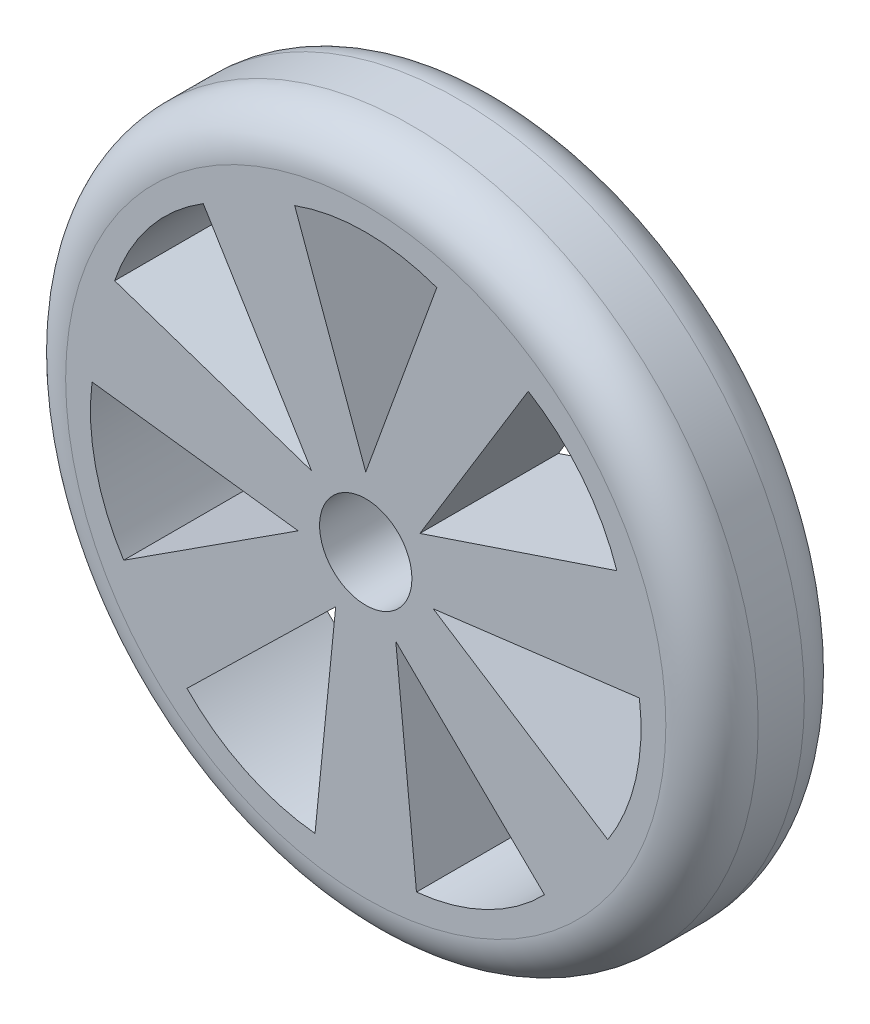
ISO-10303-21;
HEADER;
FILE_DESCRIPTION(('STEP AP214'),'2;1');
FILE_NAME('part.step','',(''),(''),'','','');
FILE_SCHEMA(('AUTOMOTIVE_DESIGN { 1 0 10303 214 1 1 1 1 }'));
ENDSEC;
DATA;
#1=APPLICATION_CONTEXT('core data for automotive mechanical design processes');
#2=APPLICATION_PROTOCOL_DEFINITION('international standard','automotive_design',2000,#1);
#3=PRODUCT_CONTEXT('',#1,'mechanical');
#4=PRODUCT('Part','Part','',(#3));
#5=PRODUCT_RELATED_PRODUCT_CATEGORY('part','',(#4));
#6=PRODUCT_DEFINITION_FORMATION('','',#4);
#7=PRODUCT_DEFINITION_CONTEXT('part definition',#1,'design');
#8=PRODUCT_DEFINITION('design','',#6,#7);
#9=PRODUCT_DEFINITION_SHAPE('','',#8);
#10=(LENGTH_UNIT() NAMED_UNIT(*) SI_UNIT(.MILLI.,.METRE.));
#11=(NAMED_UNIT(*) PLANE_ANGLE_UNIT() SI_UNIT($,.RADIAN.));
#12=(NAMED_UNIT(*) SI_UNIT($,.STERADIAN.) SOLID_ANGLE_UNIT());
#13=UNCERTAINTY_MEASURE_WITH_UNIT(LENGTH_MEASURE(1.E-05),#10,'distance_accuracy_value','');
#14=(GEOMETRIC_REPRESENTATION_CONTEXT(3) GLOBAL_UNCERTAINTY_ASSIGNED_CONTEXT((#13)) GLOBAL_UNIT_ASSIGNED_CONTEXT((#10,
#11,#12)) REPRESENTATION_CONTEXT('',''));
#15=CARTESIAN_POINT('',(0.,0.,0.));
#16=DIRECTION('',(0.,0.,1.));
#17=DIRECTION('',(1.,0.,0.));
#18=AXIS2_PLACEMENT_3D('',#15,#16,#17);
#19=CARTESIAN_POINT('',(0.,0.,30.));
#20=DIRECTION('',(0.,0.,1.));
#21=DIRECTION('',(1.,0.,0.));
#22=AXIS2_PLACEMENT_3D('',#19,#20,#21);
#23=PLANE('',#22);
#24=DIRECTION('',(0.947927346167127,0.318486650251699,0.));
#25=VECTOR('',#24,1.);
#26=CARTESIAN_POINT('',(54.384202814541,23.6842462892076,30.));
#27=LINE('',#26,#25);
#28=CARTESIAN_POINT('',(11.7274722370203,9.35234702788115,30.));
#29=VERTEX_POINT('',#28);
#30=CARTESIAN_POINT('',(54.384202814541,23.6842462892076,30.));
#31=VERTEX_POINT('',#30);
#32=EDGE_CURVE('E59',#29,#31,#27,.T.);
#33=ORIENTED_EDGE('',*,*,#32,.F.);
#34=DIRECTION('',(-0.52143520337949,-0.85329088163216,0.));
#35=VECTOR('',#34,1.);
#36=CARTESIAN_POINT('',(11.7274722370203,9.35234702788115,30.));
#37=LINE('',#36,#35);
#38=CARTESIAN_POINT('',(35.1920563890974,47.7504367013284,30.));
#39=VERTEX_POINT('',#38);
#40=EDGE_CURVE('E334',#39,#29,#37,.T.);
#41=ORIENTED_EDGE('',*,*,#40,.F.);
#42=CARTESIAN_POINT('',(11.7274722370203,9.35234702788115,30.));
#43=DIRECTION('',(0.,0.,1.));
#44=DIRECTION('',(-0.623489801858743,0.781831482468022,0.));
#45=AXIS2_PLACEMENT_3D('',#42,#43,#44);
#46=CIRCLE('',#45,45.);
#47=EDGE_CURVE('E345',#31,#39,#46,.T.);
#48=ORIENTED_EDGE('',*,*,#47,.F.);
#49=EDGE_LOOP('',(#33,#41,#48));
#50=FACE_BOUND('',#49,.T.);
#51=DIRECTION('',(0.0995678465958276,-0.9950307753654,0.));
#52=VECTOR('',#51,1.);
#53=CARTESIAN_POINT('',(10.9888091835757,-58.2909179099793,30.));
#54=LINE('',#53,#52);
#55=CARTESIAN_POINT('',(6.50825608676348,-13.5145330185362,30.));
#56=VERTEX_POINT('',#55);
#57=CARTESIAN_POINT('',(10.9888091835757,-58.2909179099793,30.));
#58=VERTEX_POINT('',#57);
#59=EDGE_CURVE('E67',#56,#58,#54,.T.);
#60=ORIENTED_EDGE('',*,*,#59,.F.);
#61=DIRECTION('',(-0.715866849259722,0.698236818086069,0.));
#62=VECTOR('',#61,1.);
#63=CARTESIAN_POINT('',(6.50825608676348,-13.5145330185362,30.));
#64=LINE('',#63,#62);
#65=CARTESIAN_POINT('',(38.722264303451,-44.9351898324094,30.));
#66=VERTEX_POINT('',#65);
#67=EDGE_CURVE('E304',#66,#56,#64,.T.);
#68=ORIENTED_EDGE('',*,*,#67,.F.);
#69=CARTESIAN_POINT('',(6.50825608676348,-13.5145330185362,30.));
#70=DIRECTION('',(0.,0.,1.));
#71=DIRECTION('',(0.900968867902416,0.433883739117565,0.));
#72=AXIS2_PLACEMENT_3D('',#69,#70,#71);
#73=CIRCLE('',#72,45.);
#74=EDGE_CURVE('E315',#58,#66,#73,.T.);
#75=ORIENTED_EDGE('',*,*,#74,.F.);
#76=EDGE_LOOP('',(#60,#68,#75));
#77=FACE_BOUND('',#76,.T.);
#78=DIRECTION('',(0.840025923150778,-0.542546263865749,0.));
#79=VECTOR('',#78,1.);
#80=CARTESIAN_POINT('',(52.4250852245124,-27.7523958833033,30.));
#81=LINE('',#80,#79);
#82=CARTESIAN_POINT('',(14.6239186827274,-3.33781400934458,30.));
#83=VERTEX_POINT('',#82);
#84=CARTESIAN_POINT('',(52.4250852245124,-27.7523958833033,30.));
#85=VERTEX_POINT('',#84);
#86=EDGE_CURVE('E279',#83,#85,#81,.T.);
#87=ORIENTED_EDGE('',*,*,#86,.F.);
#88=DIRECTION('',(-0.992239206600171,-0.124343704647492,0.));
#89=VECTOR('',#88,1.);
#90=CARTESIAN_POINT('',(14.6239186827274,-3.33781400934458,30.));
#91=LINE('',#90,#89);
#92=CARTESIAN_POINT('',(59.2746829797351,2.25765269979256,30.));
#93=VERTEX_POINT('',#92);
#94=EDGE_CURVE('E270',#93,#83,#91,.T.);
#95=ORIENTED_EDGE('',*,*,#94,.F.);
#96=CARTESIAN_POINT('',(14.6239186827274,-3.33781400934458,30.));
#97=DIRECTION('',(0.,0.,1.));
#98=DIRECTION('',(0.222520933956305,0.974927912181826,0.));
#99=AXIS2_PLACEMENT_3D('',#96,#97,#98);
#100=CIRCLE('',#99,45.);
#101=EDGE_CURVE('E282',#85,#93,#100,.T.);
#102=ORIENTED_EDGE('',*,*,#101,.F.);
#103=EDGE_LOOP('',(#87,#95,#102));
#104=FACE_BOUND('',#103,.T.);
#105=DIRECTION('',(-0.992239206600173,0.124343704647478,0.));
#106=VECTOR('',#105,1.);
#107=CARTESIAN_POINT('',(-59.2746829797351,2.25765269979174,30.));
#108=LINE('',#107,#106);
#109=CARTESIAN_POINT('',(-14.6239186827273,-3.33781400934477,30.));
#110=VERTEX_POINT('',#109);
#111=CARTESIAN_POINT('',(-59.2746829797351,2.25765269979174,30.));
#112=VERTEX_POINT('',#111);
#113=EDGE_CURVE('E229',#110,#112,#108,.T.);
#114=ORIENTED_EDGE('',*,*,#113,.F.);
#115=DIRECTION('',(0.840025923150771,0.54254626386576,0.));
#116=VECTOR('',#115,1.);
#117=CARTESIAN_POINT('',(-14.6239186827273,-3.33781400934477,30.));
#118=LINE('',#117,#116);
#119=CARTESIAN_POINT('',(-52.425085224512,-27.752395883304,30.));
#120=VERTEX_POINT('',#119);
#121=EDGE_CURVE('E237',#120,#110,#118,.T.);
#122=ORIENTED_EDGE('',*,*,#121,.F.);
#123=CARTESIAN_POINT('',(-14.6239186827273,-3.33781400934477,30.));
#124=DIRECTION('',(0.,0.,1.));
#125=DIRECTION('',(0.222520933956318,-0.974927912181823,0.));
#126=AXIS2_PLACEMENT_3D('',#123,#124,#125);
#127=CIRCLE('',#126,45.);
#128=EDGE_CURVE('E248',#112,#120,#127,.T.);
#129=ORIENTED_EDGE('',*,*,#128,.F.);
#130=EDGE_LOOP('',(#114,#122,#129));
#131=FACE_BOUND('',#130,.T.);
#132=DIRECTION('',(-0.715866849259712,-0.698236818086079,0.));
#133=VECTOR('',#132,1.);
#134=CARTESIAN_POINT('',(-38.7222643034503,-44.9351898324099,30.));
#135=LINE('',#134,#133);
#136=CARTESIAN_POINT('',(-6.50825608676329,-13.5145330185363,30.));
#137=VERTEX_POINT('',#136);
#138=CARTESIAN_POINT('',(-38.7222643034503,-44.9351898324099,30.));
#139=VERTEX_POINT('',#138);
#140=EDGE_CURVE('E194',#137,#139,#135,.T.);
#141=ORIENTED_EDGE('',*,*,#140,.F.);
#142=DIRECTION('',(0.0995678465958135,0.995030775365402,0.));
#143=VECTOR('',#142,1.);
#144=CARTESIAN_POINT('',(-6.50825608676329,-13.5145330185363,30.));
#145=LINE('',#144,#143);
#146=CARTESIAN_POINT('',(-10.9888091835749,-58.2909179099794,30.));
#147=VERTEX_POINT('',#146);
#148=EDGE_CURVE('E212',#147,#137,#145,.T.);
#149=ORIENTED_EDGE('',*,*,#148,.F.);
#150=CARTESIAN_POINT('',(-6.50825608676329,-13.5145330185363,30.));
#151=DIRECTION('',(0.,0.,1.));
#152=DIRECTION('',(0.900968867902422,-0.433883739117553,0.));
#153=AXIS2_PLACEMENT_3D('',#150,#151,#152);
#154=CIRCLE('',#153,45.);
#155=EDGE_CURVE('E216',#139,#147,#154,.T.);
#156=ORIENTED_EDGE('',*,*,#155,.F.);
#157=EDGE_LOOP('',(#141,#149,#156));
#158=FACE_BOUND('',#157,.T.);
#159=DIRECTION('',(-0.521435203379502,0.853290881632153,0.));
#160=VECTOR('',#159,1.);
#161=CARTESIAN_POINT('',(-35.1920563890981,47.7504367013279,30.));
#162=LINE('',#161,#160);
#163=CARTESIAN_POINT('',(-11.7274722370205,9.35234702788098,30.));
#164=VERTEX_POINT('',#163);
#165=CARTESIAN_POINT('',(-35.1920563890981,47.7504367013279,30.));
#166=VERTEX_POINT('',#165);
#167=EDGE_CURVE('E258',#164,#166,#162,.T.);
#168=ORIENTED_EDGE('',*,*,#167,.F.);
#169=DIRECTION('',(0.947927346167131,-0.318486650251685,0.));
#170=VECTOR('',#169,1.);
#171=CARTESIAN_POINT('',(-11.7274722370205,9.35234702788098,30.));
#172=LINE('',#171,#170);
#173=CARTESIAN_POINT('',(-54.3842028145414,23.6842462892068,30.));
#174=VERTEX_POINT('',#173);
#175=EDGE_CURVE('E364',#174,#164,#172,.T.);
#176=ORIENTED_EDGE('',*,*,#175,.F.);
#177=CARTESIAN_POINT('',(-11.7274722370205,9.35234702788098,30.));
#178=DIRECTION('',(0.,0.,1.));
#179=DIRECTION('',(-0.623489801858732,-0.781831482468031,0.));
#180=AXIS2_PLACEMENT_3D('',#177,#178,#179);
#181=CIRCLE('',#180,45.);
#182=EDGE_CURVE('E375',#166,#174,#181,.T.);
#183=ORIENTED_EDGE('',*,*,#182,.F.);
#184=EDGE_LOOP('',(#168,#176,#183));
#185=FACE_BOUND('',#184,.T.);
#186=CARTESIAN_POINT('',(0.,0.,30.));
#187=DIRECTION('',(0.,0.,1.));
#188=DIRECTION('',(1.,0.,0.));
#189=AXIS2_PLACEMENT_3D('',#186,#187,#188);
#190=CIRCLE('',#189,65.);
#191=CARTESIAN_POINT('',(65.,0.,30.));
#192=VERTEX_POINT('',#191);
#193=EDGE_CURVE('E11',#192,#192,#190,.T.);
#194=ORIENTED_EDGE('',*,*,#193,.T.);
#195=EDGE_LOOP('',(#194));
#196=FACE_BOUND('',#195,.T.);
#197=DIRECTION('',(0.342020143325666,0.939692620785909,0.));
#198=VECTOR('',#197,1.);
#199=CARTESIAN_POINT('',(15.390906449655,57.2861679353659,30.));
#200=LINE('',#199,#198);
#201=CARTESIAN_POINT('',(0.,15.,30.));
#202=VERTEX_POINT('',#201);
#203=CARTESIAN_POINT('',(15.390906449655,57.2861679353659,30.));
#204=VERTEX_POINT('',#203);
#205=EDGE_CURVE('E385',#202,#204,#200,.T.);
#206=ORIENTED_EDGE('',*,*,#205,.F.);
#207=DIRECTION('',(0.342020143325666,-0.939692620785909,0.));
#208=VECTOR('',#207,1.);
#209=CARTESIAN_POINT('',(0.,15.,30.));
#210=LINE('',#209,#208);
#211=CARTESIAN_POINT('',(-15.390906449655,57.2861679353659,30.));
#212=VERTEX_POINT('',#211);
#213=EDGE_CURVE('E397',#212,#202,#210,.T.);
#214=ORIENTED_EDGE('',*,*,#213,.F.);
#215=CARTESIAN_POINT('',(0.,15.,30.));
#216=DIRECTION('',(0.,0.,1.));
#217=DIRECTION('',(-1.,0.,0.));
#218=AXIS2_PLACEMENT_3D('',#215,#216,#217);
#219=CIRCLE('',#218,45.);
#220=EDGE_CURVE('E408',#204,#212,#219,.T.);
#221=ORIENTED_EDGE('',*,*,#220,.F.);
#222=EDGE_LOOP('',(#206,#214,#221));
#223=FACE_BOUND('',#222,.T.);
#224=CARTESIAN_POINT('',(0.,0.,30.));
#225=DIRECTION('',(0.,0.,1.));
#226=DIRECTION('',(1.,0.,0.));
#227=AXIS2_PLACEMENT_3D('',#224,#225,#226);
#228=CIRCLE('',#227,10.);
#229=CARTESIAN_POINT('',(10.,0.,30.));
#230=VERTEX_POINT('',#229);
#231=EDGE_CURVE('E425',#230,#230,#228,.T.);
#232=ORIENTED_EDGE('',*,*,#231,.F.);
#233=EDGE_LOOP('',(#232));
#234=FACE_BOUND('',#233,.T.);
#235=ADVANCED_FACE('F43',(#50,#77,#104,#131,#158,#185,#196,#223,#234),#23,.T.);
#236=CARTESIAN_POINT('',(0.,0.,0.));
#237=DIRECTION('',(0.,0.,1.));
#238=DIRECTION('',(1.,0.,0.));
#239=AXIS2_PLACEMENT_3D('',#236,#237,#238);
#240=PLANE('',#239);
#241=DIRECTION('',(-0.52143520337949,-0.85329088163216,0.));
#242=VECTOR('',#241,1.);
#243=CARTESIAN_POINT('',(11.7274722370203,9.35234702788115,0.));
#244=LINE('',#243,#242);
#245=CARTESIAN_POINT('',(35.1920563890974,47.7504367013284,0.));
#246=VERTEX_POINT('',#245);
#247=CARTESIAN_POINT('',(11.7274722370203,9.35234702788115,0.));
#248=VERTEX_POINT('',#247);
#249=EDGE_CURVE('E338',#246,#248,#244,.T.);
#250=ORIENTED_EDGE('',*,*,#249,.T.);
#251=DIRECTION('',(0.947927346167127,0.318486650251699,0.));
#252=VECTOR('',#251,1.);
#253=CARTESIAN_POINT('',(54.384202814541,23.6842462892076,0.));
#254=LINE('',#253,#252);
#255=CARTESIAN_POINT('',(54.384202814541,23.6842462892076,0.));
#256=VERTEX_POINT('',#255);
#257=EDGE_CURVE('E329',#248,#256,#254,.T.);
#258=ORIENTED_EDGE('',*,*,#257,.T.);
#259=CARTESIAN_POINT('',(11.7274722370203,9.35234702788115,0.));
#260=DIRECTION('',(0.,0.,1.));
#261=DIRECTION('',(-0.623489801858743,0.781831482468022,0.));
#262=AXIS2_PLACEMENT_3D('',#259,#260,#261);
#263=CIRCLE('',#262,45.);
#264=EDGE_CURVE('E333',#256,#246,#263,.T.);
#265=ORIENTED_EDGE('',*,*,#264,.T.);
#266=EDGE_LOOP('',(#250,#258,#265));
#267=FACE_BOUND('',#266,.T.);
#268=DIRECTION('',(-0.715866849259722,0.698236818086069,0.));
#269=VECTOR('',#268,1.);
#270=CARTESIAN_POINT('',(6.50825608676348,-13.5145330185362,0.));
#271=LINE('',#270,#269);
#272=CARTESIAN_POINT('',(38.722264303451,-44.9351898324094,0.));
#273=VERTEX_POINT('',#272);
#274=CARTESIAN_POINT('',(6.50825608676348,-13.5145330185362,0.));
#275=VERTEX_POINT('',#274);
#276=EDGE_CURVE('E308',#273,#275,#271,.T.);
#277=ORIENTED_EDGE('',*,*,#276,.T.);
#278=DIRECTION('',(0.0995678465958276,-0.9950307753654,0.));
#279=VECTOR('',#278,1.);
#280=CARTESIAN_POINT('',(10.9888091835757,-58.2909179099793,0.));
#281=LINE('',#280,#279);
#282=CARTESIAN_POINT('',(10.9888091835757,-58.2909179099793,0.));
#283=VERTEX_POINT('',#282);
#284=EDGE_CURVE('E299',#275,#283,#281,.T.);
#285=ORIENTED_EDGE('',*,*,#284,.T.);
#286=CARTESIAN_POINT('',(6.50825608676348,-13.5145330185362,0.));
#287=DIRECTION('',(0.,0.,1.));
#288=DIRECTION('',(0.900968867902416,0.433883739117565,0.));
#289=AXIS2_PLACEMENT_3D('',#286,#287,#288);
#290=CIRCLE('',#289,45.);
#291=EDGE_CURVE('E303',#283,#273,#290,.T.);
#292=ORIENTED_EDGE('',*,*,#291,.T.);
#293=EDGE_LOOP('',(#277,#285,#292));
#294=FACE_BOUND('',#293,.T.);
#295=DIRECTION('',(-0.992239206600171,-0.124343704647492,0.));
#296=VECTOR('',#295,1.);
#297=CARTESIAN_POINT('',(14.6239186827274,-3.33781400934458,0.));
#298=LINE('',#297,#296);
#299=CARTESIAN_POINT('',(59.2746829797351,2.25765269979256,0.));
#300=VERTEX_POINT('',#299);
#301=CARTESIAN_POINT('',(14.6239186827274,-3.33781400934458,0.));
#302=VERTEX_POINT('',#301);
#303=EDGE_CURVE('E274',#300,#302,#298,.T.);
#304=ORIENTED_EDGE('',*,*,#303,.T.);
#305=DIRECTION('',(0.840025923150778,-0.542546263865749,0.));
#306=VECTOR('',#305,1.);
#307=CARTESIAN_POINT('',(52.4250852245124,-27.7523958833033,0.));
#308=LINE('',#307,#306);
#309=CARTESIAN_POINT('',(52.4250852245124,-27.7523958833033,0.));
#310=VERTEX_POINT('',#309);
#311=EDGE_CURVE('E265',#302,#310,#308,.T.);
#312=ORIENTED_EDGE('',*,*,#311,.T.);
#313=CARTESIAN_POINT('',(14.6239186827274,-3.33781400934458,0.));
#314=DIRECTION('',(0.,0.,1.));
#315=DIRECTION('',(0.222520933956305,0.974927912181826,0.));
#316=AXIS2_PLACEMENT_3D('',#313,#314,#315);
#317=CIRCLE('',#316,45.);
#318=EDGE_CURVE('E269',#310,#300,#317,.T.);
#319=ORIENTED_EDGE('',*,*,#318,.T.);
#320=EDGE_LOOP('',(#304,#312,#319));
#321=FACE_BOUND('',#320,.T.);
#322=DIRECTION('',(0.840025923150771,0.54254626386576,0.));
#323=VECTOR('',#322,1.);
#324=CARTESIAN_POINT('',(-14.6239186827273,-3.33781400934477,0.));
#325=LINE('',#324,#323);
#326=CARTESIAN_POINT('',(-52.425085224512,-27.752395883304,0.));
#327=VERTEX_POINT('',#326);
#328=CARTESIAN_POINT('',(-14.6239186827273,-3.33781400934477,0.));
#329=VERTEX_POINT('',#328);
#330=EDGE_CURVE('E241',#327,#329,#325,.T.);
#331=ORIENTED_EDGE('',*,*,#330,.T.);
#332=DIRECTION('',(-0.992239206600173,0.124343704647478,0.));
#333=VECTOR('',#332,1.);
#334=CARTESIAN_POINT('',(-59.2746829797351,2.25765269979174,0.));
#335=LINE('',#334,#333);
#336=CARTESIAN_POINT('',(-59.2746829797351,2.25765269979174,0.));
#337=VERTEX_POINT('',#336);
#338=EDGE_CURVE('E232',#329,#337,#335,.T.);
#339=ORIENTED_EDGE('',*,*,#338,.T.);
#340=CARTESIAN_POINT('',(-14.6239186827273,-3.33781400934477,0.));
#341=DIRECTION('',(0.,0.,1.));
#342=DIRECTION('',(0.222520933956318,-0.974927912181823,0.));
#343=AXIS2_PLACEMENT_3D('',#340,#341,#342);
#344=CIRCLE('',#343,45.);
#345=EDGE_CURVE('E236',#337,#327,#344,.T.);
#346=ORIENTED_EDGE('',*,*,#345,.T.);
#347=EDGE_LOOP('',(#331,#339,#346));
#348=FACE_BOUND('',#347,.T.);
#349=DIRECTION('',(0.0995678465958135,0.995030775365402,0.));
#350=VECTOR('',#349,1.);
#351=CARTESIAN_POINT('',(-6.50825608676329,-13.5145330185363,0.));
#352=LINE('',#351,#350);
#353=CARTESIAN_POINT('',(-10.9888091835749,-58.2909179099794,0.));
#354=VERTEX_POINT('',#353);
#355=CARTESIAN_POINT('',(-6.50825608676329,-13.5145330185363,0.));
#356=VERTEX_POINT('',#355);
#357=EDGE_CURVE('E200',#354,#356,#352,.T.);
#358=ORIENTED_EDGE('',*,*,#357,.T.);
#359=DIRECTION('',(-0.715866849259712,-0.698236818086079,0.));
#360=VECTOR('',#359,1.);
#361=CARTESIAN_POINT('',(-38.7222643034503,-44.9351898324099,0.));
#362=LINE('',#361,#360);
#363=CARTESIAN_POINT('',(-38.7222643034503,-44.9351898324099,0.));
#364=VERTEX_POINT('',#363);
#365=EDGE_CURVE('E191',#356,#364,#362,.T.);
#366=ORIENTED_EDGE('',*,*,#365,.T.);
#367=CARTESIAN_POINT('',(-6.50825608676329,-13.5145330185363,0.));
#368=DIRECTION('',(0.,0.,1.));
#369=DIRECTION('',(0.900968867902422,-0.433883739117553,0.));
#370=AXIS2_PLACEMENT_3D('',#367,#368,#369);
#371=CIRCLE('',#370,45.);
#372=EDGE_CURVE('E204',#364,#354,#371,.T.);
#373=ORIENTED_EDGE('',*,*,#372,.T.);
#374=EDGE_LOOP('',(#358,#366,#373));
#375=FACE_BOUND('',#374,.T.);
#376=DIRECTION('',(0.947927346167131,-0.318486650251685,0.));
#377=VECTOR('',#376,1.);
#378=CARTESIAN_POINT('',(-11.7274722370205,9.35234702788098,0.));
#379=LINE('',#378,#377);
#380=CARTESIAN_POINT('',(-54.3842028145414,23.6842462892068,0.));
#381=VERTEX_POINT('',#380);
#382=CARTESIAN_POINT('',(-11.7274722370205,9.35234702788098,0.));
#383=VERTEX_POINT('',#382);
#384=EDGE_CURVE('E368',#381,#383,#379,.T.);
#385=ORIENTED_EDGE('',*,*,#384,.T.);
#386=DIRECTION('',(-0.521435203379502,0.853290881632153,0.));
#387=VECTOR('',#386,1.);
#388=CARTESIAN_POINT('',(-35.1920563890981,47.7504367013279,0.));
#389=LINE('',#388,#387);
#390=CARTESIAN_POINT('',(-35.1920563890981,47.7504367013279,0.));
#391=VERTEX_POINT('',#390);
#392=EDGE_CURVE('E359',#383,#391,#389,.T.);
#393=ORIENTED_EDGE('',*,*,#392,.T.);
#394=CARTESIAN_POINT('',(-11.7274722370205,9.35234702788098,0.));
#395=DIRECTION('',(0.,0.,1.));
#396=DIRECTION('',(-0.623489801858732,-0.781831482468031,0.));
#397=AXIS2_PLACEMENT_3D('',#394,#395,#396);
#398=CIRCLE('',#397,45.);
#399=EDGE_CURVE('E363',#391,#381,#398,.T.);
#400=ORIENTED_EDGE('',*,*,#399,.T.);
#401=EDGE_LOOP('',(#385,#393,#400));
#402=FACE_BOUND('',#401,.T.);
#403=CARTESIAN_POINT('',(0.,0.,0.));
#404=DIRECTION('',(0.,0.,1.));
#405=DIRECTION('',(1.,0.,0.));
#406=AXIS2_PLACEMENT_3D('',#403,#404,#405);
#407=CIRCLE('',#406,65.);
#408=CARTESIAN_POINT('',(65.,0.,0.));
#409=VERTEX_POINT('',#408);
#410=EDGE_CURVE('E52',#409,#409,#407,.F.);
#411=ORIENTED_EDGE('',*,*,#410,.T.);
#412=EDGE_LOOP('',(#411));
#413=FACE_BOUND('',#412,.T.);
#414=DIRECTION('',(0.342020143325666,-0.939692620785909,0.));
#415=VECTOR('',#414,1.);
#416=CARTESIAN_POINT('',(0.,15.,0.));
#417=LINE('',#416,#415);
#418=CARTESIAN_POINT('',(-15.390906449655,57.2861679353659,0.));
#419=VERTEX_POINT('',#418);
#420=CARTESIAN_POINT('',(0.,15.,0.));
#421=VERTEX_POINT('',#420);
#422=EDGE_CURVE('E401',#419,#421,#417,.T.);
#423=ORIENTED_EDGE('',*,*,#422,.T.);
#424=DIRECTION('',(0.342020143325666,0.939692620785909,0.));
#425=VECTOR('',#424,1.);
#426=CARTESIAN_POINT('',(15.390906449655,57.2861679353659,0.));
#427=LINE('',#426,#425);
#428=CARTESIAN_POINT('',(15.390906449655,57.2861679353659,0.));
#429=VERTEX_POINT('',#428);
#430=EDGE_CURVE('E392',#421,#429,#427,.T.);
#431=ORIENTED_EDGE('',*,*,#430,.T.);
#432=CARTESIAN_POINT('',(0.,15.,0.));
#433=DIRECTION('',(0.,0.,1.));
#434=DIRECTION('',(-1.,0.,0.));
#435=AXIS2_PLACEMENT_3D('',#432,#433,#434);
#436=CIRCLE('',#435,45.);
#437=EDGE_CURVE('E396',#429,#419,#436,.T.);
#438=ORIENTED_EDGE('',*,*,#437,.T.);
#439=EDGE_LOOP('',(#423,#431,#438));
#440=FACE_BOUND('',#439,.T.);
#441=CARTESIAN_POINT('',(0.,0.,0.));
#442=DIRECTION('',(0.,0.,1.));
#443=DIRECTION('',(1.,0.,0.));
#444=AXIS2_PLACEMENT_3D('',#441,#442,#443);
#445=CIRCLE('',#444,10.);
#446=CARTESIAN_POINT('',(10.,0.,0.));
#447=VERTEX_POINT('',#446);
#448=EDGE_CURVE('E418',#447,#447,#445,.T.);
#449=ORIENTED_EDGE('',*,*,#448,.T.);
#450=EDGE_LOOP('',(#449));
#451=FACE_BOUND('',#450,.T.);
#452=ADVANCED_FACE('F209',(#267,#294,#321,#348,#375,#402,#413,#440,#451),#240,.F.);
#453=CARTESIAN_POINT('',(0.,0.,30.));
#454=DIRECTION('',(0.,0.,-1.));
#455=DIRECTION('',(-1.,0.,0.));
#456=AXIS2_PLACEMENT_3D('',#453,#454,#455);
#457=CYLINDRICAL_SURFACE('',#456,75.);
#458=CARTESIAN_POINT('',(0.,0.,10.));
#459=DIRECTION('',(0.,0.,1.));
#460=DIRECTION('',(1.,0.,0.));
#461=AXIS2_PLACEMENT_3D('',#458,#459,#460);
#462=CIRCLE('',#461,75.);
#463=CARTESIAN_POINT('',(75.,0.,10.));
#464=VERTEX_POINT('',#463);
#465=EDGE_CURVE('E436',#464,#464,#462,.T.);
#466=ORIENTED_EDGE('',*,*,#465,.T.);
#467=EDGE_LOOP('',(#466));
#468=FACE_BOUND('',#467,.T.);
#469=CARTESIAN_POINT('',(0.,0.,20.));
#470=DIRECTION('',(0.,0.,1.));
#471=DIRECTION('',(1.,0.,0.));
#472=AXIS2_PLACEMENT_3D('',#469,#470,#471);
#473=CIRCLE('',#472,75.);
#474=CARTESIAN_POINT('',(75.,0.,20.));
#475=VERTEX_POINT('',#474);
#476=EDGE_CURVE('E429',#475,#475,#473,.F.);
#477=ORIENTED_EDGE('',*,*,#476,.T.);
#478=EDGE_LOOP('',(#477));
#479=FACE_BOUND('',#478,.T.);
#480=ADVANCED_FACE('F451',(#468,#479),#457,.T.);
#481=CARTESIAN_POINT('',(0.,0.,30.));
#482=DIRECTION('',(0.,0.,-1.));
#483=DIRECTION('',(-1.,0.,0.));
#484=AXIS2_PLACEMENT_3D('',#481,#482,#483);
#485=CYLINDRICAL_SURFACE('',#484,10.);
#486=ORIENTED_EDGE('',*,*,#231,.T.);
#487=EDGE_LOOP('',(#486));
#488=FACE_BOUND('',#487,.T.);
#489=ORIENTED_EDGE('',*,*,#448,.F.);
#490=EDGE_LOOP('',(#489));
#491=FACE_BOUND('',#490,.T.);
#492=ADVANCED_FACE('F454',(#488,#491),#485,.F.);
#493=CARTESIAN_POINT('',(15.390906449655,57.2861679353659,0.));
#494=DIRECTION('',(0.93969262078591,-0.342020143325666,0.));
#495=DIRECTION('',(0.342020143325666,0.93969262078591,0.));
#496=AXIS2_PLACEMENT_3D('',#493,#494,#495);
#497=PLANE('',#496);
#498=ORIENTED_EDGE('',*,*,#205,.T.);
#499=DIRECTION('',(0.,0.,1.));
#500=VECTOR('',#499,1.);
#501=CARTESIAN_POINT('',(15.390906449655,57.2861679353659,0.));
#502=LINE('',#501,#500);
#503=EDGE_CURVE('E405',#429,#204,#502,.T.);
#504=ORIENTED_EDGE('',*,*,#503,.F.);
#505=ORIENTED_EDGE('',*,*,#430,.F.);
#506=DIRECTION('',(0.,0.,1.));
#507=VECTOR('',#506,1.);
#508=CARTESIAN_POINT('',(0.,15.,0.));
#509=LINE('',#508,#507);
#510=EDGE_CURVE('E415',#421,#202,#509,.T.);
#511=ORIENTED_EDGE('',*,*,#510,.T.);
#512=EDGE_LOOP('',(#498,#504,#505,#511));
#513=FACE_BOUND('',#512,.T.);
#514=ADVANCED_FACE('F475',(#513),#497,.F.);
#515=CARTESIAN_POINT('',(0.,15.,0.));
#516=DIRECTION('',(-0.939692620785909,-0.342020143325666,0.));
#517=DIRECTION('',(0.342020143325666,-0.93969262078591,0.));
#518=AXIS2_PLACEMENT_3D('',#515,#516,#517);
#519=PLANE('',#518);
#520=ORIENTED_EDGE('',*,*,#213,.T.);
#521=ORIENTED_EDGE('',*,*,#510,.F.);
#522=ORIENTED_EDGE('',*,*,#422,.F.);
#523=DIRECTION('',(0.,0.,1.));
#524=VECTOR('',#523,1.);
#525=CARTESIAN_POINT('',(-15.390906449655,57.2861679353659,0.));
#526=LINE('',#525,#524);
#527=EDGE_CURVE('E419',#419,#212,#526,.T.);
#528=ORIENTED_EDGE('',*,*,#527,.T.);
#529=EDGE_LOOP('',(#520,#521,#522,#528));
#530=FACE_BOUND('',#529,.T.);
#531=ADVANCED_FACE('F488',(#530),#519,.F.);
#532=CARTESIAN_POINT('',(0.,15.,0.));
#533=DIRECTION('',(0.,0.,1.));
#534=DIRECTION('',(1.,0.,0.));
#535=AXIS2_PLACEMENT_3D('',#532,#533,#534);
#536=CYLINDRICAL_SURFACE('',#535,45.);
#537=ORIENTED_EDGE('',*,*,#220,.T.);
#538=ORIENTED_EDGE('',*,*,#527,.F.);
#539=ORIENTED_EDGE('',*,*,#437,.F.);
#540=ORIENTED_EDGE('',*,*,#503,.T.);
#541=EDGE_LOOP('',(#537,#538,#539,#540));
#542=FACE_BOUND('',#541,.T.);
#543=ADVANCED_FACE('F448',(#542),#536,.F.);
#544=CARTESIAN_POINT('',(0.,0.,10.));
#545=DIRECTION('',(0.,0.,1.));
#546=DIRECTION('',(1.,0.,0.));
#547=AXIS2_PLACEMENT_3D('',#544,#545,#546);
#548=TOROIDAL_SURFACE('',#547,65.,10.);
#549=ORIENTED_EDGE('',*,*,#410,.F.);
#550=EDGE_LOOP('',(#549));
#551=FACE_BOUND('',#550,.T.);
#552=ORIENTED_EDGE('',*,*,#465,.F.);
#553=EDGE_LOOP('',(#552));
#554=FACE_BOUND('',#553,.T.);
#555=ADVANCED_FACE('F445',(#551,#554),#548,.T.);
#556=CARTESIAN_POINT('',(0.,0.,20.));
#557=DIRECTION('',(0.,0.,1.));
#558=DIRECTION('',(1.,0.,0.));
#559=AXIS2_PLACEMENT_3D('',#556,#557,#558);
#560=TOROIDAL_SURFACE('',#559,65.,10.);
#561=ORIENTED_EDGE('',*,*,#476,.F.);
#562=EDGE_LOOP('',(#561));
#563=FACE_BOUND('',#562,.T.);
#564=ORIENTED_EDGE('',*,*,#193,.F.);
#565=EDGE_LOOP('',(#564));
#566=FACE_BOUND('',#565,.T.);
#567=ADVANCED_FACE('F45',(#563,#566),#560,.T.);
#568=CARTESIAN_POINT('',(-35.1920563890981,47.7504367013279,0.));
#569=DIRECTION('',(0.853290881632153,0.521435203379502,0.));
#570=DIRECTION('',(-0.521435203379502,0.853290881632153,0.));
#571=AXIS2_PLACEMENT_3D('',#568,#569,#570);
#572=PLANE('',#571);
#573=ORIENTED_EDGE('',*,*,#167,.T.);
#574=DIRECTION('',(0.,0.,1.));
#575=VECTOR('',#574,1.);
#576=CARTESIAN_POINT('',(-35.1920563890981,47.7504367013279,0.));
#577=LINE('',#576,#575);
#578=EDGE_CURVE('E372',#391,#166,#577,.T.);
#579=ORIENTED_EDGE('',*,*,#578,.F.);
#580=ORIENTED_EDGE('',*,*,#392,.F.);
#581=DIRECTION('',(0.,0.,1.));
#582=VECTOR('',#581,1.);
#583=CARTESIAN_POINT('',(-11.7274722370205,9.35234702788098,0.));
#584=LINE('',#583,#582);
#585=EDGE_CURVE('E382',#383,#164,#584,.T.);
#586=ORIENTED_EDGE('',*,*,#585,.T.);
#587=EDGE_LOOP('',(#573,#579,#580,#586));
#588=FACE_BOUND('',#587,.T.);
#589=ADVANCED_FACE('F460',(#588),#572,.F.);
#590=CARTESIAN_POINT('',(-11.7274722370205,9.35234702788098,0.));
#591=DIRECTION('',(-0.318486650251685,-0.947927346167131,0.));
#592=DIRECTION('',(0.947927346167131,-0.318486650251685,0.));
#593=AXIS2_PLACEMENT_3D('',#590,#591,#592);
#594=PLANE('',#593);
#595=ORIENTED_EDGE('',*,*,#175,.T.);
#596=ORIENTED_EDGE('',*,*,#585,.F.);
#597=ORIENTED_EDGE('',*,*,#384,.F.);
#598=DIRECTION('',(0.,0.,1.));
#599=VECTOR('',#598,1.);
#600=CARTESIAN_POINT('',(-54.3842028145414,23.6842462892068,0.));
#601=LINE('',#600,#599);
#602=EDGE_CURVE('E386',#381,#174,#601,.T.);
#603=ORIENTED_EDGE('',*,*,#602,.T.);
#604=EDGE_LOOP('',(#595,#596,#597,#603));
#605=FACE_BOUND('',#604,.T.);
#606=ADVANCED_FACE('F498',(#605),#594,.F.);
#607=CARTESIAN_POINT('',(-11.7274722370205,9.35234702788098,0.));
#608=DIRECTION('',(0.,0.,1.));
#609=DIRECTION('',(1.,0.,0.));
#610=AXIS2_PLACEMENT_3D('',#607,#608,#609);
#611=CYLINDRICAL_SURFACE('',#610,45.);
#612=ORIENTED_EDGE('',*,*,#182,.T.);
#613=ORIENTED_EDGE('',*,*,#602,.F.);
#614=ORIENTED_EDGE('',*,*,#399,.F.);
#615=ORIENTED_EDGE('',*,*,#578,.T.);
#616=EDGE_LOOP('',(#612,#613,#614,#615));
#617=FACE_BOUND('',#616,.T.);
#618=ADVANCED_FACE('F500',(#617),#611,.F.);
#619=CARTESIAN_POINT('',(-38.7222643034503,-44.9351898324099,0.));
#620=DIRECTION('',(-0.69823681808608,0.715866849259712,0.));
#621=DIRECTION('',(-0.715866849259712,-0.69823681808608,0.));
#622=AXIS2_PLACEMENT_3D('',#619,#620,#621);
#623=PLANE('',#622);
#624=ORIENTED_EDGE('',*,*,#140,.T.);
#625=DIRECTION('',(0.,0.,1.));
#626=VECTOR('',#625,1.);
#627=CARTESIAN_POINT('',(-38.7222643034503,-44.9351898324099,0.));
#628=LINE('',#627,#626);
#629=EDGE_CURVE('E187',#364,#139,#628,.T.);
#630=ORIENTED_EDGE('',*,*,#629,.F.);
#631=ORIENTED_EDGE('',*,*,#365,.F.);
#632=DIRECTION('',(0.,0.,1.));
#633=VECTOR('',#632,1.);
#634=CARTESIAN_POINT('',(-6.50825608676329,-13.5145330185363,0.));
#635=LINE('',#634,#633);
#636=EDGE_CURVE('E226',#356,#137,#635,.T.);
#637=ORIENTED_EDGE('',*,*,#636,.T.);
#638=EDGE_LOOP('',(#624,#630,#631,#637));
#639=FACE_BOUND('',#638,.T.);
#640=ADVANCED_FACE('F189',(#639),#623,.F.);
#641=CARTESIAN_POINT('',(-6.50825608676329,-13.5145330185363,0.));
#642=DIRECTION('',(0.995030775365402,-0.0995678465958135,0.));
#643=DIRECTION('',(0.0995678465958135,0.995030775365402,0.));
#644=AXIS2_PLACEMENT_3D('',#641,#642,#643);
#645=PLANE('',#644);
#646=ORIENTED_EDGE('',*,*,#148,.T.);
#647=ORIENTED_EDGE('',*,*,#636,.F.);
#648=ORIENTED_EDGE('',*,*,#357,.F.);
#649=DIRECTION('',(0.,0.,1.));
#650=VECTOR('',#649,1.);
#651=CARTESIAN_POINT('',(-10.9888091835749,-58.2909179099794,0.));
#652=LINE('',#651,#650);
#653=EDGE_CURVE('E199',#354,#147,#652,.T.);
#654=ORIENTED_EDGE('',*,*,#653,.T.);
#655=EDGE_LOOP('',(#646,#647,#648,#654));
#656=FACE_BOUND('',#655,.T.);
#657=ADVANCED_FACE('F555',(#656),#645,.F.);
#658=CARTESIAN_POINT('',(-6.50825608676329,-13.5145330185363,0.));
#659=DIRECTION('',(0.,0.,1.));
#660=DIRECTION('',(1.,0.,0.));
#661=AXIS2_PLACEMENT_3D('',#658,#659,#660);
#662=CYLINDRICAL_SURFACE('',#661,45.);
#663=ORIENTED_EDGE('',*,*,#155,.T.);
#664=ORIENTED_EDGE('',*,*,#653,.F.);
#665=ORIENTED_EDGE('',*,*,#372,.F.);
#666=ORIENTED_EDGE('',*,*,#629,.T.);
#667=EDGE_LOOP('',(#663,#664,#665,#666));
#668=FACE_BOUND('',#667,.T.);
#669=ADVANCED_FACE('F205',(#668),#662,.F.);
#670=CARTESIAN_POINT('',(-59.2746829797351,2.25765269979174,0.));
#671=DIRECTION('',(0.124343704647478,0.992239206600173,0.));
#672=DIRECTION('',(-0.992239206600173,0.124343704647478,0.));
#673=AXIS2_PLACEMENT_3D('',#670,#671,#672);
#674=PLANE('',#673);
#675=ORIENTED_EDGE('',*,*,#113,.T.);
#676=DIRECTION('',(0.,0.,1.));
#677=VECTOR('',#676,1.);
#678=CARTESIAN_POINT('',(-59.2746829797351,2.25765269979174,0.));
#679=LINE('',#678,#677);
#680=EDGE_CURVE('E245',#337,#112,#679,.T.);
#681=ORIENTED_EDGE('',*,*,#680,.F.);
#682=ORIENTED_EDGE('',*,*,#338,.F.);
#683=DIRECTION('',(0.,0.,1.));
#684=VECTOR('',#683,1.);
#685=CARTESIAN_POINT('',(-14.6239186827273,-3.33781400934477,0.));
#686=LINE('',#685,#684);
#687=EDGE_CURVE('E255',#329,#110,#686,.T.);
#688=ORIENTED_EDGE('',*,*,#687,.T.);
#689=EDGE_LOOP('',(#675,#681,#682,#688));
#690=FACE_BOUND('',#689,.T.);
#691=ADVANCED_FACE('F542',(#690),#674,.F.);
#692=CARTESIAN_POINT('',(-14.6239186827273,-3.33781400934477,0.));
#693=DIRECTION('',(0.54254626386576,-0.840025923150771,0.));
#694=DIRECTION('',(0.840025923150771,0.54254626386576,0.));
#695=AXIS2_PLACEMENT_3D('',#692,#693,#694);
#696=PLANE('',#695);
#697=ORIENTED_EDGE('',*,*,#121,.T.);
#698=ORIENTED_EDGE('',*,*,#687,.F.);
#699=ORIENTED_EDGE('',*,*,#330,.F.);
#700=DIRECTION('',(0.,0.,1.));
#701=VECTOR('',#700,1.);
#702=CARTESIAN_POINT('',(-52.425085224512,-27.752395883304,0.));
#703=LINE('',#702,#701);
#704=EDGE_CURVE('E259',#327,#120,#703,.T.);
#705=ORIENTED_EDGE('',*,*,#704,.T.);
#706=EDGE_LOOP('',(#697,#698,#699,#705));
#707=FACE_BOUND('',#706,.T.);
#708=ADVANCED_FACE('F545',(#707),#696,.F.);
#709=CARTESIAN_POINT('',(-14.6239186827273,-3.33781400934477,0.));
#710=DIRECTION('',(0.,0.,1.));
#711=DIRECTION('',(1.,0.,0.));
#712=AXIS2_PLACEMENT_3D('',#709,#710,#711);
#713=CYLINDRICAL_SURFACE('',#712,45.);
#714=ORIENTED_EDGE('',*,*,#128,.T.);
#715=ORIENTED_EDGE('',*,*,#704,.F.);
#716=ORIENTED_EDGE('',*,*,#345,.F.);
#717=ORIENTED_EDGE('',*,*,#680,.T.);
#718=EDGE_LOOP('',(#714,#715,#716,#717));
#719=FACE_BOUND('',#718,.T.);
#720=ADVANCED_FACE('F534',(#719),#713,.F.);
#721=CARTESIAN_POINT('',(52.4250852245124,-27.7523958833033,0.));
#722=DIRECTION('',(-0.542546263865749,-0.840025923150778,0.));
#723=DIRECTION('',(0.840025923150778,-0.542546263865749,0.));
#724=AXIS2_PLACEMENT_3D('',#721,#722,#723);
#725=PLANE('',#724);
#726=ORIENTED_EDGE('',*,*,#86,.T.);
#727=DIRECTION('',(0.,0.,1.));
#728=VECTOR('',#727,1.);
#729=CARTESIAN_POINT('',(52.4250852245124,-27.7523958833033,0.));
#730=LINE('',#729,#728);
#731=EDGE_CURVE('E278',#310,#85,#730,.T.);
#732=ORIENTED_EDGE('',*,*,#731,.F.);
#733=ORIENTED_EDGE('',*,*,#311,.F.);
#734=DIRECTION('',(0.,0.,1.));
#735=VECTOR('',#734,1.);
#736=CARTESIAN_POINT('',(14.6239186827274,-3.33781400934458,0.));
#737=LINE('',#736,#735);
#738=EDGE_CURVE('E290',#302,#83,#737,.T.);
#739=ORIENTED_EDGE('',*,*,#738,.T.);
#740=EDGE_LOOP('',(#726,#732,#733,#739));
#741=FACE_BOUND('',#740,.T.);
#742=ADVANCED_FACE('F530',(#741),#725,.F.);
#743=CARTESIAN_POINT('',(14.6239186827274,-3.33781400934458,0.));
#744=DIRECTION('',(-0.124343704647492,0.992239206600171,0.));
#745=DIRECTION('',(-0.992239206600171,-0.124343704647492,0.));
#746=AXIS2_PLACEMENT_3D('',#743,#744,#745);
#747=PLANE('',#746);
#748=ORIENTED_EDGE('',*,*,#94,.T.);
#749=ORIENTED_EDGE('',*,*,#738,.F.);
#750=ORIENTED_EDGE('',*,*,#303,.F.);
#751=DIRECTION('',(0.,0.,1.));
#752=VECTOR('',#751,1.);
#753=CARTESIAN_POINT('',(59.2746829797351,2.25765269979256,0.));
#754=LINE('',#753,#752);
#755=EDGE_CURVE('E293',#300,#93,#754,.T.);
#756=ORIENTED_EDGE('',*,*,#755,.T.);
#757=EDGE_LOOP('',(#748,#749,#750,#756));
#758=FACE_BOUND('',#757,.T.);
#759=ADVANCED_FACE('F533',(#758),#747,.F.);
#760=CARTESIAN_POINT('',(14.6239186827274,-3.33781400934458,0.));
#761=DIRECTION('',(0.,0.,1.));
#762=DIRECTION('',(1.,0.,0.));
#763=AXIS2_PLACEMENT_3D('',#760,#761,#762);
#764=CYLINDRICAL_SURFACE('',#763,45.);
#765=ORIENTED_EDGE('',*,*,#101,.T.);
#766=ORIENTED_EDGE('',*,*,#755,.F.);
#767=ORIENTED_EDGE('',*,*,#318,.F.);
#768=ORIENTED_EDGE('',*,*,#731,.T.);
#769=EDGE_LOOP('',(#765,#766,#767,#768));
#770=FACE_BOUND('',#769,.T.);
#771=ADVANCED_FACE('F523',(#770),#764,.F.);
#772=CARTESIAN_POINT('',(10.9888091835757,-58.2909179099793,0.));
#773=DIRECTION('',(-0.9950307753654,-0.0995678465958276,0.));
#774=DIRECTION('',(0.0995678465958277,-0.9950307753654,0.));
#775=AXIS2_PLACEMENT_3D('',#772,#773,#774);
#776=PLANE('',#775);
#777=ORIENTED_EDGE('',*,*,#59,.T.);
#778=DIRECTION('',(0.,0.,1.));
#779=VECTOR('',#778,1.);
#780=CARTESIAN_POINT('',(10.9888091835757,-58.2909179099793,0.));
#781=LINE('',#780,#779);
#782=EDGE_CURVE('E312',#283,#58,#781,.T.);
#783=ORIENTED_EDGE('',*,*,#782,.F.);
#784=ORIENTED_EDGE('',*,*,#284,.F.);
#785=DIRECTION('',(0.,0.,1.));
#786=VECTOR('',#785,1.);
#787=CARTESIAN_POINT('',(6.50825608676348,-13.5145330185362,0.));
#788=LINE('',#787,#786);
#789=EDGE_CURVE('E223',#275,#56,#788,.T.);
#790=ORIENTED_EDGE('',*,*,#789,.T.);
#791=EDGE_LOOP('',(#777,#783,#784,#790));
#792=FACE_BOUND('',#791,.T.);
#793=ADVANCED_FACE('F519',(#792),#776,.F.);
#794=CARTESIAN_POINT('',(6.50825608676348,-13.5145330185362,0.));
#795=DIRECTION('',(0.698236818086069,0.715866849259722,0.));
#796=DIRECTION('',(-0.715866849259722,0.698236818086069,0.));
#797=AXIS2_PLACEMENT_3D('',#794,#795,#796);
#798=PLANE('',#797);
#799=ORIENTED_EDGE('',*,*,#67,.T.);
#800=ORIENTED_EDGE('',*,*,#789,.F.);
#801=ORIENTED_EDGE('',*,*,#276,.F.);
#802=DIRECTION('',(0.,0.,1.));
#803=VECTOR('',#802,1.);
#804=CARTESIAN_POINT('',(38.722264303451,-44.9351898324094,0.));
#805=LINE('',#804,#803);
#806=EDGE_CURVE('E324',#273,#66,#805,.T.);
#807=ORIENTED_EDGE('',*,*,#806,.T.);
#808=EDGE_LOOP('',(#799,#800,#801,#807));
#809=FACE_BOUND('',#808,.T.);
#810=ADVANCED_FACE('F522',(#809),#798,.F.);
#811=CARTESIAN_POINT('',(6.50825608676348,-13.5145330185362,0.));
#812=DIRECTION('',(0.,0.,1.));
#813=DIRECTION('',(1.,0.,0.));
#814=AXIS2_PLACEMENT_3D('',#811,#812,#813);
#815=CYLINDRICAL_SURFACE('',#814,45.);
#816=ORIENTED_EDGE('',*,*,#74,.T.);
#817=ORIENTED_EDGE('',*,*,#806,.F.);
#818=ORIENTED_EDGE('',*,*,#291,.F.);
#819=ORIENTED_EDGE('',*,*,#782,.T.);
#820=EDGE_LOOP('',(#816,#817,#818,#819));
#821=FACE_BOUND('',#820,.T.);
#822=ADVANCED_FACE('F511',(#821),#815,.F.);
#823=CARTESIAN_POINT('',(54.384202814541,23.6842462892076,0.));
#824=DIRECTION('',(0.318486650251699,-0.947927346167127,0.));
#825=DIRECTION('',(0.947927346167127,0.318486650251699,0.));
#826=AXIS2_PLACEMENT_3D('',#823,#824,#825);
#827=PLANE('',#826);
#828=ORIENTED_EDGE('',*,*,#32,.T.);
#829=DIRECTION('',(0.,0.,1.));
#830=VECTOR('',#829,1.);
#831=CARTESIAN_POINT('',(54.384202814541,23.6842462892076,0.));
#832=LINE('',#831,#830);
#833=EDGE_CURVE('E342',#256,#31,#832,.T.);
#834=ORIENTED_EDGE('',*,*,#833,.F.);
#835=ORIENTED_EDGE('',*,*,#257,.F.);
#836=DIRECTION('',(0.,0.,1.));
#837=VECTOR('',#836,1.);
#838=CARTESIAN_POINT('',(11.7274722370203,9.35234702788115,0.));
#839=LINE('',#838,#837);
#840=EDGE_CURVE('E283',#248,#29,#839,.T.);
#841=ORIENTED_EDGE('',*,*,#840,.T.);
#842=EDGE_LOOP('',(#828,#834,#835,#841));
#843=FACE_BOUND('',#842,.T.);
#844=ADVANCED_FACE('F507',(#843),#827,.F.);
#845=CARTESIAN_POINT('',(11.7274722370203,9.35234702788115,0.));
#846=DIRECTION('',(-0.853290881632161,0.52143520337949,0.));
#847=DIRECTION('',(-0.52143520337949,-0.853290881632161,0.));
#848=AXIS2_PLACEMENT_3D('',#845,#846,#847);
#849=PLANE('',#848);
#850=ORIENTED_EDGE('',*,*,#40,.T.);
#851=ORIENTED_EDGE('',*,*,#840,.F.);
#852=ORIENTED_EDGE('',*,*,#249,.F.);
#853=DIRECTION('',(0.,0.,1.));
#854=VECTOR('',#853,1.);
#855=CARTESIAN_POINT('',(35.1920563890974,47.7504367013284,0.));
#856=LINE('',#855,#854);
#857=EDGE_CURVE('E354',#246,#39,#856,.T.);
#858=ORIENTED_EDGE('',*,*,#857,.T.);
#859=EDGE_LOOP('',(#850,#851,#852,#858));
#860=FACE_BOUND('',#859,.T.);
#861=ADVANCED_FACE('F510',(#860),#849,.F.);
#862=CARTESIAN_POINT('',(11.7274722370203,9.35234702788115,0.));
#863=DIRECTION('',(0.,0.,1.));
#864=DIRECTION('',(1.,0.,0.));
#865=AXIS2_PLACEMENT_3D('',#862,#863,#864);
#866=CYLINDRICAL_SURFACE('',#865,45.);
#867=ORIENTED_EDGE('',*,*,#47,.T.);
#868=ORIENTED_EDGE('',*,*,#857,.F.);
#869=ORIENTED_EDGE('',*,*,#264,.F.);
#870=ORIENTED_EDGE('',*,*,#833,.T.);
#871=EDGE_LOOP('',(#867,#868,#869,#870));
#872=FACE_BOUND('',#871,.T.);
#873=ADVANCED_FACE('F512',(#872),#866,.F.);
#874=CLOSED_SHELL('',(#235,#452,#480,#492,#514,#531,#543,#555,#567,#589,#606,#618,#640,#657,
#669,#691,#708,#720,#742,#759,#771,#793,#810,#822,#844,#861,#873));
#875=MANIFOLD_SOLID_BREP('B2',#874);
#876=ADVANCED_BREP_SHAPE_REPRESENTATION('',(#18,#875),#14);
#877=SHAPE_DEFINITION_REPRESENTATION(#9,#876);
ENDSEC;
END-ISO-10303-21;
